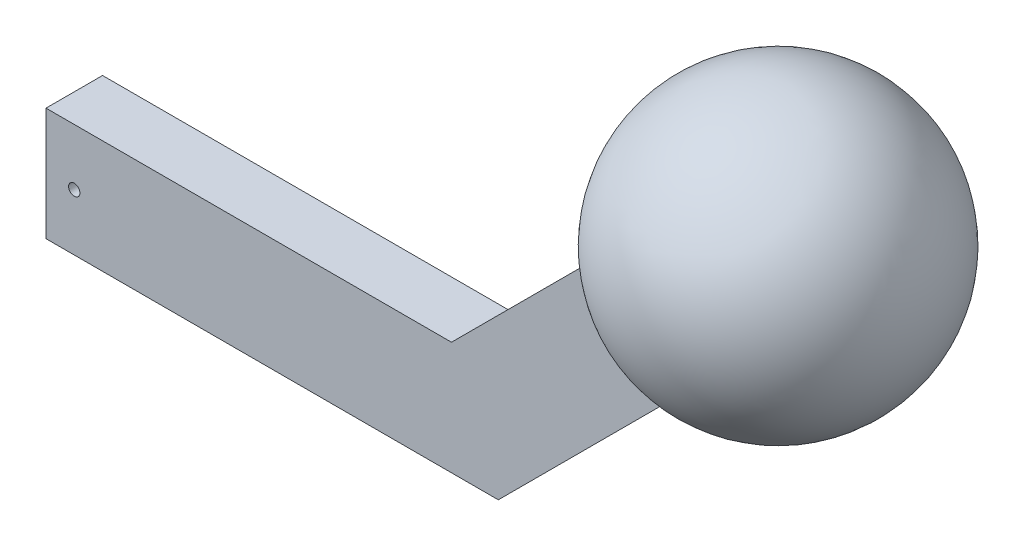
ISO-10303-21;
HEADER;
FILE_DESCRIPTION(('STEP AP214'),'2;1');
FILE_NAME('part.step','',(''),(''),'','','');
FILE_SCHEMA(('AUTOMOTIVE_DESIGN { 1 0 10303 214 1 1 1 1 }'));
ENDSEC;
DATA;
#1=APPLICATION_CONTEXT('core data for automotive mechanical design processes');
#2=APPLICATION_PROTOCOL_DEFINITION('international standard','automotive_design',2000,#1);
#3=PRODUCT_CONTEXT('',#1,'mechanical');
#4=PRODUCT('Part','Part','',(#3));
#5=PRODUCT_RELATED_PRODUCT_CATEGORY('part','',(#4));
#6=PRODUCT_DEFINITION_FORMATION('','',#4);
#7=PRODUCT_DEFINITION_CONTEXT('part definition',#1,'design');
#8=PRODUCT_DEFINITION('design','',#6,#7);
#9=PRODUCT_DEFINITION_SHAPE('','',#8);
#10=(LENGTH_UNIT() NAMED_UNIT(*) SI_UNIT(.MILLI.,.METRE.));
#11=(NAMED_UNIT(*) PLANE_ANGLE_UNIT() SI_UNIT($,.RADIAN.));
#12=(NAMED_UNIT(*) SI_UNIT($,.STERADIAN.) SOLID_ANGLE_UNIT());
#13=UNCERTAINTY_MEASURE_WITH_UNIT(LENGTH_MEASURE(1.E-05),#10,'distance_accuracy_value','');
#14=(GEOMETRIC_REPRESENTATION_CONTEXT(3) GLOBAL_UNCERTAINTY_ASSIGNED_CONTEXT((#13)) GLOBAL_UNIT_ASSIGNED_CONTEXT((#10,
#11,#12)) REPRESENTATION_CONTEXT('',''));
#15=CARTESIAN_POINT('',(0.,0.,0.));
#16=DIRECTION('',(0.,0.,1.));
#17=DIRECTION('',(1.,0.,0.));
#18=AXIS2_PLACEMENT_3D('',#15,#16,#17);
#19=CARTESIAN_POINT('',(115.355339059327,35.3553390593275,10.));
#20=DIRECTION('',(-0.707106781186545,-0.70710678118655,0.));
#21=DIRECTION('',(0.70710678118655,-0.707106781186545,0.));
#22=AXIS2_PLACEMENT_3D('',#19,#20,#21);
#23=PLANE('',#22);
#24=DIRECTION('',(-0.70710678118655,0.707106781186545,0.));
#25=VECTOR('',#24,1.);
#26=CARTESIAN_POINT('',(115.355339059327,35.3553390593275,10.));
#27=LINE('',#26,#25);
#28=CARTESIAN_POINT('',(102.160546890504,48.5501312281508,10.));
#29=VERTEX_POINT('',#28);
#30=CARTESIAN_POINT('',(101.213203435596,49.4974746830584,10.));
#31=VERTEX_POINT('',#30);
#32=EDGE_CURVE('E197',#29,#31,#27,.T.);
#33=ORIENTED_EDGE('',*,*,#32,.F.);
#34=CARTESIAN_POINT('',(108.284271247462,42.4264068711929,5.));
#35=DIRECTION('',(-0.707106781186546,-0.707106781186549,0.));
#36=DIRECTION('',(0.707106781186549,-0.707106781186546,0.));
#37=AXIS2_PLACEMENT_3D('',#34,#35,#36);
#38=CIRCLE('',#37,9.99999999999999);
#39=CARTESIAN_POINT('',(101.213203435596,49.4974746830584,5.));
#40=VERTEX_POINT('',#39);
#41=EDGE_CURVE('E271',#29,#40,#38,.T.);
#42=ORIENTED_EDGE('',*,*,#41,.T.);
#43=DIRECTION('',(0.,0.,-1.));
#44=VECTOR('',#43,1.);
#45=CARTESIAN_POINT('',(101.213203435596,49.4974746830584,10.));
#46=LINE('',#45,#44);
#47=EDGE_CURVE('E235',#31,#40,#46,.T.);
#48=ORIENTED_EDGE('',*,*,#47,.F.);
#49=EDGE_LOOP('',(#33,#42,#48));
#50=FACE_BOUND('',#49,.T.);
#51=ADVANCED_FACE('F39',(#50),#23,.F.);
#52=CARTESIAN_POINT('',(101.213203435596,49.4974746830584,0.));
#53=VERTEX_POINT('',#52);
#54=EDGE_CURVE('E234',#40,#53,#46,.T.);
#55=ORIENTED_EDGE('',*,*,#54,.F.);
#56=CARTESIAN_POINT('',(102.160546890504,48.5501312281508,0.));
#57=VERTEX_POINT('',#56);
#58=EDGE_CURVE('E274',#40,#57,#38,.T.);
#59=ORIENTED_EDGE('',*,*,#58,.T.);
#60=DIRECTION('',(-0.70710678118655,0.707106781186545,0.));
#61=VECTOR('',#60,1.);
#62=CARTESIAN_POINT('',(115.355339059327,35.3553390593275,0.));
#63=LINE('',#62,#61);
#64=EDGE_CURVE('E218',#57,#53,#63,.T.);
#65=ORIENTED_EDGE('',*,*,#64,.T.);
#66=EDGE_LOOP('',(#55,#59,#65));
#67=FACE_BOUND('',#66,.T.);
#68=ADVANCED_FACE('F314',(#67),#23,.F.);
#69=DIRECTION('',(0.,0.,-1.));
#70=VECTOR('',#69,1.);
#71=CARTESIAN_POINT('',(115.355339059327,35.3553390593275,10.));
#72=LINE('',#71,#70);
#73=CARTESIAN_POINT('',(115.355339059327,35.3553390593275,10.));
#74=VERTEX_POINT('',#73);
#75=CARTESIAN_POINT('',(115.355339059327,35.3553390593275,5.));
#76=VERTEX_POINT('',#75);
#77=EDGE_CURVE('E240',#74,#76,#72,.T.);
#78=ORIENTED_EDGE('',*,*,#77,.T.);
#79=CARTESIAN_POINT('',(114.40799560442,36.302682514235,10.));
#80=VERTEX_POINT('',#79);
#81=EDGE_CURVE('E64',#76,#80,#38,.T.);
#82=ORIENTED_EDGE('',*,*,#81,.T.);
#83=EDGE_CURVE('E198',#74,#80,#27,.T.);
#84=ORIENTED_EDGE('',*,*,#83,.F.);
#85=EDGE_LOOP('',(#78,#82,#84));
#86=FACE_BOUND('',#85,.T.);
#87=ADVANCED_FACE('F320',(#86),#23,.F.);
#88=CARTESIAN_POINT('',(0.,0.,10.));
#89=DIRECTION('',(0.,0.,1.));
#90=DIRECTION('',(1.,0.,0.));
#91=AXIS2_PLACEMENT_3D('',#88,#89,#90);
#92=PLANE('',#91);
#93=DIRECTION('',(0.,-1.,0.));
#94=VECTOR('',#93,1.);
#95=CARTESIAN_POINT('',(0.,20.,10.));
#96=LINE('',#95,#94);
#97=CARTESIAN_POINT('',(0.,20.,10.));
#98=VERTEX_POINT('',#97);
#99=CARTESIAN_POINT('',(0.,0.,10.));
#100=VERTEX_POINT('',#99);
#101=EDGE_CURVE('E186',#98,#100,#96,.T.);
#102=ORIENTED_EDGE('',*,*,#101,.T.);
#103=DIRECTION('',(1.,0.,0.));
#104=VECTOR('',#103,1.);
#105=CARTESIAN_POINT('',(0.,0.,10.));
#106=LINE('',#105,#104);
#107=CARTESIAN_POINT('',(80.,0.,10.));
#108=VERTEX_POINT('',#107);
#109=EDGE_CURVE('E190',#100,#108,#106,.T.);
#110=ORIENTED_EDGE('',*,*,#109,.T.);
#111=DIRECTION('',(0.707106781186546,0.707106781186549,0.));
#112=VECTOR('',#111,1.);
#113=CARTESIAN_POINT('',(80.,0.,10.));
#114=LINE('',#113,#112);
#115=EDGE_CURVE('E194',#108,#74,#114,.T.);
#116=ORIENTED_EDGE('',*,*,#115,.T.);
#117=ORIENTED_EDGE('',*,*,#83,.T.);
#118=DIRECTION('',(0.707106781186549,-0.707106781186546,0.));
#119=VECTOR('',#118,1.);
#120=CARTESIAN_POINT('',(75.3553390593271,75.3553390593275,10.));
#121=LINE('',#120,#119);
#122=EDGE_CURVE('E178',#29,#80,#121,.T.);
#123=ORIENTED_EDGE('',*,*,#122,.F.);
#124=ORIENTED_EDGE('',*,*,#32,.T.);
#125=DIRECTION('',(-0.707106781186546,-0.707106781186549,0.));
#126=VECTOR('',#125,1.);
#127=CARTESIAN_POINT('',(101.213203435596,49.4974746830584,10.));
#128=LINE('',#127,#126);
#129=CARTESIAN_POINT('',(71.7157287525381,20.,10.));
#130=VERTEX_POINT('',#129);
#131=EDGE_CURVE('E202',#31,#130,#128,.T.);
#132=ORIENTED_EDGE('',*,*,#131,.T.);
#133=DIRECTION('',(-1.,0.,0.));
#134=VECTOR('',#133,1.);
#135=CARTESIAN_POINT('',(71.7157287525381,20.,10.));
#136=LINE('',#135,#134);
#137=EDGE_CURVE('E205',#130,#98,#136,.T.);
#138=ORIENTED_EDGE('',*,*,#137,.T.);
#139=EDGE_LOOP('',(#102,#110,#116,#117,#123,#124,#132,#138));
#140=FACE_BOUND('',#139,.T.);
#141=CARTESIAN_POINT('',(5.,10.,10.));
#142=DIRECTION('',(0.,0.,1.));
#143=DIRECTION('',(1.,0.,0.));
#144=AXIS2_PLACEMENT_3D('',#141,#142,#143);
#145=CIRCLE('',#144,1.);
#146=CARTESIAN_POINT('',(6.,10.,10.));
#147=VERTEX_POINT('',#146);
#148=EDGE_CURVE('E181',#147,#147,#145,.T.);
#149=ORIENTED_EDGE('',*,*,#148,.F.);
#150=EDGE_LOOP('',(#149));
#151=FACE_BOUND('',#150,.T.);
#152=ADVANCED_FACE('F335',(#140,#151),#92,.T.);
#153=CARTESIAN_POINT('',(0.,0.,0.));
#154=DIRECTION('',(0.,0.,1.));
#155=DIRECTION('',(1.,0.,0.));
#156=AXIS2_PLACEMENT_3D('',#153,#154,#155);
#157=PLANE('',#156);
#158=DIRECTION('',(0.,-1.,0.));
#159=VECTOR('',#158,1.);
#160=CARTESIAN_POINT('',(0.,20.,0.));
#161=LINE('',#160,#159);
#162=CARTESIAN_POINT('',(0.,6.5,0.));
#163=VERTEX_POINT('',#162);
#164=CARTESIAN_POINT('',(0.,0.,0.));
#165=VERTEX_POINT('',#164);
#166=EDGE_CURVE('E185',#163,#165,#161,.T.);
#167=ORIENTED_EDGE('',*,*,#166,.F.);
#168=DIRECTION('',(-1.,0.,0.));
#169=VECTOR('',#168,1.);
#170=CARTESIAN_POINT('',(0.,6.5,0.));
#171=LINE('',#170,#169);
#172=CARTESIAN_POINT('',(23.,6.5,0.));
#173=VERTEX_POINT('',#172);
#174=EDGE_CURVE('E155',#173,#163,#171,.T.);
#175=ORIENTED_EDGE('',*,*,#174,.F.);
#176=DIRECTION('',(0.,-1.,0.));
#177=VECTOR('',#176,1.);
#178=CARTESIAN_POINT('',(23.,13.5,0.));
#179=LINE('',#178,#177);
#180=CARTESIAN_POINT('',(23.,13.5,0.));
#181=VERTEX_POINT('',#180);
#182=EDGE_CURVE('E291',#181,#173,#179,.T.);
#183=ORIENTED_EDGE('',*,*,#182,.F.);
#184=DIRECTION('',(1.,0.,0.));
#185=VECTOR('',#184,1.);
#186=CARTESIAN_POINT('',(0.,13.5,0.));
#187=LINE('',#186,#185);
#188=CARTESIAN_POINT('',(0.,13.5,0.));
#189=VERTEX_POINT('',#188);
#190=EDGE_CURVE('E294',#189,#181,#187,.T.);
#191=ORIENTED_EDGE('',*,*,#190,.F.);
#192=CARTESIAN_POINT('',(0.,20.,0.));
#193=VERTEX_POINT('',#192);
#194=EDGE_CURVE('E160',#193,#189,#161,.T.);
#195=ORIENTED_EDGE('',*,*,#194,.F.);
#196=DIRECTION('',(-1.,0.,0.));
#197=VECTOR('',#196,1.);
#198=CARTESIAN_POINT('',(71.7157287525381,20.,0.));
#199=LINE('',#198,#197);
#200=CARTESIAN_POINT('',(71.7157287525381,20.,0.));
#201=VERTEX_POINT('',#200);
#202=EDGE_CURVE('E191',#201,#193,#199,.T.);
#203=ORIENTED_EDGE('',*,*,#202,.F.);
#204=DIRECTION('',(-0.707106781186546,-0.707106781186549,0.));
#205=VECTOR('',#204,1.);
#206=CARTESIAN_POINT('',(101.213203435596,49.4974746830584,0.));
#207=LINE('',#206,#205);
#208=EDGE_CURVE('E223',#53,#201,#207,.T.);
#209=ORIENTED_EDGE('',*,*,#208,.F.);
#210=ORIENTED_EDGE('',*,*,#64,.F.);
#211=DIRECTION('',(0.707106781186549,-0.707106781186546,0.));
#212=VECTOR('',#211,1.);
#213=CARTESIAN_POINT('',(75.3553390593271,75.3553390593275,0.));
#214=LINE('',#213,#212);
#215=CARTESIAN_POINT('',(114.40799560442,36.302682514235,0.));
#216=VERTEX_POINT('',#215);
#217=EDGE_CURVE('E172',#57,#216,#214,.T.);
#218=ORIENTED_EDGE('',*,*,#217,.T.);
#219=CARTESIAN_POINT('',(115.355339059327,35.3553390593275,0.));
#220=VERTEX_POINT('',#219);
#221=EDGE_CURVE('E219',#220,#216,#63,.T.);
#222=ORIENTED_EDGE('',*,*,#221,.F.);
#223=DIRECTION('',(0.707106781186546,0.707106781186549,0.));
#224=VECTOR('',#223,1.);
#225=CARTESIAN_POINT('',(80.,0.,0.));
#226=LINE('',#225,#224);
#227=CARTESIAN_POINT('',(80.,0.,0.));
#228=VERTEX_POINT('',#227);
#229=EDGE_CURVE('E214',#228,#220,#226,.T.);
#230=ORIENTED_EDGE('',*,*,#229,.F.);
#231=DIRECTION('',(1.,0.,0.));
#232=VECTOR('',#231,1.);
#233=CARTESIAN_POINT('',(0.,0.,0.));
#234=LINE('',#233,#232);
#235=EDGE_CURVE('E211',#165,#228,#234,.T.);
#236=ORIENTED_EDGE('',*,*,#235,.F.);
#237=EDGE_LOOP('',(#167,#175,#183,#191,#195,#203,#209,#210,#218,#222,#230,#236));
#238=FACE_BOUND('',#237,.T.);
#239=ADVANCED_FACE('F258',(#238),#157,.F.);
#240=CARTESIAN_POINT('',(0.,20.,10.));
#241=DIRECTION('',(1.,0.,0.));
#242=DIRECTION('',(0.,1.,0.));
#243=AXIS2_PLACEMENT_3D('',#240,#241,#242);
#244=PLANE('',#243);
#245=DIRECTION('',(0.,1.,0.));
#246=VECTOR('',#245,1.);
#247=CARTESIAN_POINT('',(0.,13.5,2.));
#248=LINE('',#247,#246);
#249=CARTESIAN_POINT('',(0.,6.5,2.));
#250=VERTEX_POINT('',#249);
#251=CARTESIAN_POINT('',(0.,13.5,2.));
#252=VERTEX_POINT('',#251);
#253=EDGE_CURVE('E148',#250,#252,#248,.T.);
#254=ORIENTED_EDGE('',*,*,#253,.F.);
#255=DIRECTION('',(0.,0.,-1.));
#256=VECTOR('',#255,1.);
#257=CARTESIAN_POINT('',(0.,6.5,2.));
#258=LINE('',#257,#256);
#259=EDGE_CURVE('E283',#250,#163,#258,.T.);
#260=ORIENTED_EDGE('',*,*,#259,.T.);
#261=ORIENTED_EDGE('',*,*,#166,.T.);
#262=DIRECTION('',(0.,0.,-1.));
#263=VECTOR('',#262,1.);
#264=CARTESIAN_POINT('',(0.,0.,10.));
#265=LINE('',#264,#263);
#266=EDGE_CURVE('E11',#100,#165,#265,.T.);
#267=ORIENTED_EDGE('',*,*,#266,.F.);
#268=ORIENTED_EDGE('',*,*,#101,.F.);
#269=DIRECTION('',(0.,0.,-1.));
#270=VECTOR('',#269,1.);
#271=CARTESIAN_POINT('',(0.,20.,10.));
#272=LINE('',#271,#270);
#273=EDGE_CURVE('E208',#98,#193,#272,.T.);
#274=ORIENTED_EDGE('',*,*,#273,.T.);
#275=ORIENTED_EDGE('',*,*,#194,.T.);
#276=DIRECTION('',(0.,0.,-1.));
#277=VECTOR('',#276,1.);
#278=CARTESIAN_POINT('',(0.,13.5,2.));
#279=LINE('',#278,#277);
#280=EDGE_CURVE('E142',#252,#189,#279,.T.);
#281=ORIENTED_EDGE('',*,*,#280,.F.);
#282=EDGE_LOOP('',(#254,#260,#261,#267,#268,#274,#275,#281));
#283=FACE_BOUND('',#282,.T.);
#284=ADVANCED_FACE('F41',(#283),#244,.F.);
#285=CARTESIAN_POINT('',(0.,0.,10.));
#286=DIRECTION('',(0.,1.,0.));
#287=DIRECTION('',(0.,0.,1.));
#288=AXIS2_PLACEMENT_3D('',#285,#286,#287);
#289=PLANE('',#288);
#290=ORIENTED_EDGE('',*,*,#235,.T.);
#291=DIRECTION('',(0.,0.,-1.));
#292=VECTOR('',#291,1.);
#293=CARTESIAN_POINT('',(80.,0.,10.));
#294=LINE('',#293,#292);
#295=EDGE_CURVE('E49',#108,#228,#294,.T.);
#296=ORIENTED_EDGE('',*,*,#295,.F.);
#297=ORIENTED_EDGE('',*,*,#109,.F.);
#298=ORIENTED_EDGE('',*,*,#266,.T.);
#299=EDGE_LOOP('',(#290,#296,#297,#298));
#300=FACE_BOUND('',#299,.T.);
#301=ADVANCED_FACE('F333',(#300),#289,.F.);
#302=CARTESIAN_POINT('',(80.,0.,10.));
#303=DIRECTION('',(-0.707106781186549,0.707106781186546,0.));
#304=DIRECTION('',(-0.707106781186546,-0.707106781186549,0.));
#305=AXIS2_PLACEMENT_3D('',#302,#303,#304);
#306=PLANE('',#305);
#307=ORIENTED_EDGE('',*,*,#229,.T.);
#308=EDGE_CURVE('E239',#76,#220,#72,.T.);
#309=ORIENTED_EDGE('',*,*,#308,.F.);
#310=ORIENTED_EDGE('',*,*,#77,.F.);
#311=ORIENTED_EDGE('',*,*,#115,.F.);
#312=ORIENTED_EDGE('',*,*,#295,.T.);
#313=EDGE_LOOP('',(#307,#309,#310,#311,#312));
#314=FACE_BOUND('',#313,.T.);
#315=ADVANCED_FACE('F250',(#314),#306,.F.);
#316=ORIENTED_EDGE('',*,*,#221,.T.);
#317=EDGE_CURVE('E174',#216,#76,#38,.T.);
#318=ORIENTED_EDGE('',*,*,#317,.T.);
#319=ORIENTED_EDGE('',*,*,#308,.T.);
#320=EDGE_LOOP('',(#316,#318,#319));
#321=FACE_BOUND('',#320,.T.);
#322=ADVANCED_FACE('F261',(#321),#23,.F.);
#323=CARTESIAN_POINT('',(101.213203435596,49.4974746830584,10.));
#324=DIRECTION('',(0.707106781186549,-0.707106781186546,0.));
#325=DIRECTION('',(0.707106781186546,0.707106781186549,0.));
#326=AXIS2_PLACEMENT_3D('',#323,#324,#325);
#327=PLANE('',#326);
#328=ORIENTED_EDGE('',*,*,#208,.T.);
#329=DIRECTION('',(0.,0.,-1.));
#330=VECTOR('',#329,1.);
#331=CARTESIAN_POINT('',(71.7157287525381,20.,10.));
#332=LINE('',#331,#330);
#333=EDGE_CURVE('E230',#130,#201,#332,.T.);
#334=ORIENTED_EDGE('',*,*,#333,.F.);
#335=ORIENTED_EDGE('',*,*,#131,.F.);
#336=ORIENTED_EDGE('',*,*,#47,.T.);
#337=ORIENTED_EDGE('',*,*,#54,.T.);
#338=EDGE_LOOP('',(#328,#334,#335,#336,#337));
#339=FACE_BOUND('',#338,.T.);
#340=ADVANCED_FACE('F326',(#339),#327,.F.);
#341=CARTESIAN_POINT('',(71.7157287525381,20.,10.));
#342=DIRECTION('',(0.,-1.,0.));
#343=DIRECTION('',(1.,0.,0.));
#344=AXIS2_PLACEMENT_3D('',#341,#342,#343);
#345=PLANE('',#344);
#346=ORIENTED_EDGE('',*,*,#202,.T.);
#347=ORIENTED_EDGE('',*,*,#273,.F.);
#348=ORIENTED_EDGE('',*,*,#137,.F.);
#349=ORIENTED_EDGE('',*,*,#333,.T.);
#350=EDGE_LOOP('',(#346,#347,#348,#349));
#351=FACE_BOUND('',#350,.T.);
#352=ADVANCED_FACE('F331',(#351),#345,.F.);
#353=CARTESIAN_POINT('',(5.,10.,10.));
#354=DIRECTION('',(0.,0.,-1.));
#355=DIRECTION('',(-1.,0.,0.));
#356=AXIS2_PLACEMENT_3D('',#353,#354,#355);
#357=CYLINDRICAL_SURFACE('',#356,1.);
#358=CARTESIAN_POINT('',(5.,10.,2.));
#359=DIRECTION('',(0.,0.,1.));
#360=DIRECTION('',(1.,0.,0.));
#361=AXIS2_PLACEMENT_3D('',#358,#359,#360);
#362=CIRCLE('',#361,1.);
#363=CARTESIAN_POINT('',(6.,10.,2.));
#364=VERTEX_POINT('',#363);
#365=EDGE_CURVE('E43',#364,#364,#362,.T.);
#366=ORIENTED_EDGE('',*,*,#365,.F.);
#367=EDGE_LOOP('',(#366));
#368=FACE_BOUND('',#367,.T.);
#369=ORIENTED_EDGE('',*,*,#148,.T.);
#370=EDGE_LOOP('',(#369));
#371=FACE_BOUND('',#370,.T.);
#372=ADVANCED_FACE('F360',(#368,#371),#357,.F.);
#373=CARTESIAN_POINT('',(108.284271247462,42.4264068711929,5.));
#374=DIRECTION('',(-0.707106781186546,-0.707106781186549,0.));
#375=DIRECTION('',(0.707106781186549,-0.707106781186546,0.));
#376=AXIS2_PLACEMENT_3D('',#373,#374,#375);
#377=PLANE('',#376);
#378=ORIENTED_EDGE('',*,*,#217,.F.);
#379=EDGE_CURVE('E277',#57,#216,#38,.T.);
#380=ORIENTED_EDGE('',*,*,#379,.T.);
#381=EDGE_LOOP('',(#378,#380));
#382=FACE_BOUND('',#381,.T.);
#383=ADVANCED_FACE('F357',(#382),#377,.T.);
#384=EDGE_CURVE('E173',#80,#29,#38,.T.);
#385=ORIENTED_EDGE('',*,*,#384,.T.);
#386=ORIENTED_EDGE('',*,*,#122,.T.);
#387=EDGE_LOOP('',(#385,#386));
#388=FACE_BOUND('',#387,.T.);
#389=ADVANCED_FACE('F359',(#388),#377,.T.);
#390=CARTESIAN_POINT('',(124.486122993481,58.6282586172126,5.));
#391=DIRECTION('',(-0.707106781186546,-0.707106781186549,0.));
#392=DIRECTION('',(0.707106781186549,-0.707106781186546,0.));
#393=AXIS2_PLACEMENT_3D('',#390,#391,#392);
#394=SPHERICAL_SURFACE('',#393,25.);
#395=ORIENTED_EDGE('',*,*,#81,.F.);
#396=ORIENTED_EDGE('',*,*,#317,.F.);
#397=ORIENTED_EDGE('',*,*,#379,.F.);
#398=ORIENTED_EDGE('',*,*,#58,.F.);
#399=ORIENTED_EDGE('',*,*,#41,.F.);
#400=ORIENTED_EDGE('',*,*,#384,.F.);
#401=EDGE_LOOP('',(#395,#396,#397,#398,#399,#400));
#402=FACE_BOUND('',#401,.T.);
#403=ADVANCED_FACE('F311',(#402),#394,.T.);
#404=CARTESIAN_POINT('',(0.,6.5,2.));
#405=DIRECTION('',(0.,-1.,0.));
#406=DIRECTION('',(1.,0.,0.));
#407=AXIS2_PLACEMENT_3D('',#404,#405,#406);
#408=PLANE('',#407);
#409=ORIENTED_EDGE('',*,*,#174,.T.);
#410=ORIENTED_EDGE('',*,*,#259,.F.);
#411=DIRECTION('',(-1.,0.,0.));
#412=VECTOR('',#411,1.);
#413=CARTESIAN_POINT('',(0.,6.5,2.));
#414=LINE('',#413,#412);
#415=CARTESIAN_POINT('',(23.,6.5,2.));
#416=VERTEX_POINT('',#415);
#417=EDGE_CURVE('E56',#416,#250,#414,.T.);
#418=ORIENTED_EDGE('',*,*,#417,.F.);
#419=DIRECTION('',(0.,0.,-1.));
#420=VECTOR('',#419,1.);
#421=CARTESIAN_POINT('',(23.,6.5,2.));
#422=LINE('',#421,#420);
#423=EDGE_CURVE('E165',#416,#173,#422,.T.);
#424=ORIENTED_EDGE('',*,*,#423,.T.);
#425=EDGE_LOOP('',(#409,#410,#418,#424));
#426=FACE_BOUND('',#425,.T.);
#427=ADVANCED_FACE('F299',(#426),#408,.F.);
#428=CARTESIAN_POINT('',(23.,13.5,2.));
#429=DIRECTION('',(1.,0.,0.));
#430=DIRECTION('',(0.,0.,-1.));
#431=AXIS2_PLACEMENT_3D('',#428,#429,#430);
#432=PLANE('',#431);
#433=ORIENTED_EDGE('',*,*,#182,.T.);
#434=ORIENTED_EDGE('',*,*,#423,.F.);
#435=DIRECTION('',(0.,-1.,0.));
#436=VECTOR('',#435,1.);
#437=CARTESIAN_POINT('',(23.,13.5,2.));
#438=LINE('',#437,#436);
#439=CARTESIAN_POINT('',(23.,13.5,2.));
#440=VERTEX_POINT('',#439);
#441=EDGE_CURVE('E147',#440,#416,#438,.T.);
#442=ORIENTED_EDGE('',*,*,#441,.F.);
#443=DIRECTION('',(0.,0.,-1.));
#444=VECTOR('',#443,1.);
#445=CARTESIAN_POINT('',(23.,13.5,2.));
#446=LINE('',#445,#444);
#447=EDGE_CURVE('E144',#440,#181,#446,.T.);
#448=ORIENTED_EDGE('',*,*,#447,.T.);
#449=EDGE_LOOP('',(#433,#434,#442,#448));
#450=FACE_BOUND('',#449,.T.);
#451=ADVANCED_FACE('F303',(#450),#432,.F.);
#452=CARTESIAN_POINT('',(0.,13.5,2.));
#453=DIRECTION('',(0.,1.,0.));
#454=DIRECTION('',(-1.,0.,0.));
#455=AXIS2_PLACEMENT_3D('',#452,#453,#454);
#456=PLANE('',#455);
#457=ORIENTED_EDGE('',*,*,#190,.T.);
#458=ORIENTED_EDGE('',*,*,#447,.F.);
#459=DIRECTION('',(1.,0.,0.));
#460=VECTOR('',#459,1.);
#461=CARTESIAN_POINT('',(0.,13.5,2.));
#462=LINE('',#461,#460);
#463=EDGE_CURVE('E138',#252,#440,#462,.T.);
#464=ORIENTED_EDGE('',*,*,#463,.F.);
#465=ORIENTED_EDGE('',*,*,#280,.T.);
#466=EDGE_LOOP('',(#457,#458,#464,#465));
#467=FACE_BOUND('',#466,.T.);
#468=ADVANCED_FACE('F140',(#467),#456,.F.);
#469=CARTESIAN_POINT('',(0.,0.,2.));
#470=DIRECTION('',(0.,0.,1.));
#471=DIRECTION('',(1.,0.,0.));
#472=AXIS2_PLACEMENT_3D('',#469,#470,#471);
#473=PLANE('',#472);
#474=ORIENTED_EDGE('',*,*,#365,.T.);
#475=EDGE_LOOP('',(#474));
#476=FACE_BOUND('',#475,.T.);
#477=ORIENTED_EDGE('',*,*,#253,.T.);
#478=ORIENTED_EDGE('',*,*,#463,.T.);
#479=ORIENTED_EDGE('',*,*,#441,.T.);
#480=ORIENTED_EDGE('',*,*,#417,.T.);
#481=EDGE_LOOP('',(#477,#478,#479,#480));
#482=FACE_BOUND('',#481,.T.);
#483=ADVANCED_FACE('F151',(#476,#482),#473,.F.);
#484=CLOSED_SHELL('',(#51,#68,#87,#152,#239,#284,#301,#315,#322,#340,#352,#372,#383,#389,#403,
#427,#451,#468,#483));
#485=MANIFOLD_SOLID_BREP('B2',#484);
#486=ADVANCED_BREP_SHAPE_REPRESENTATION('',(#18,#485),#14);
#487=SHAPE_DEFINITION_REPRESENTATION(#9,#486);
ENDSEC;
END-ISO-10303-21;
